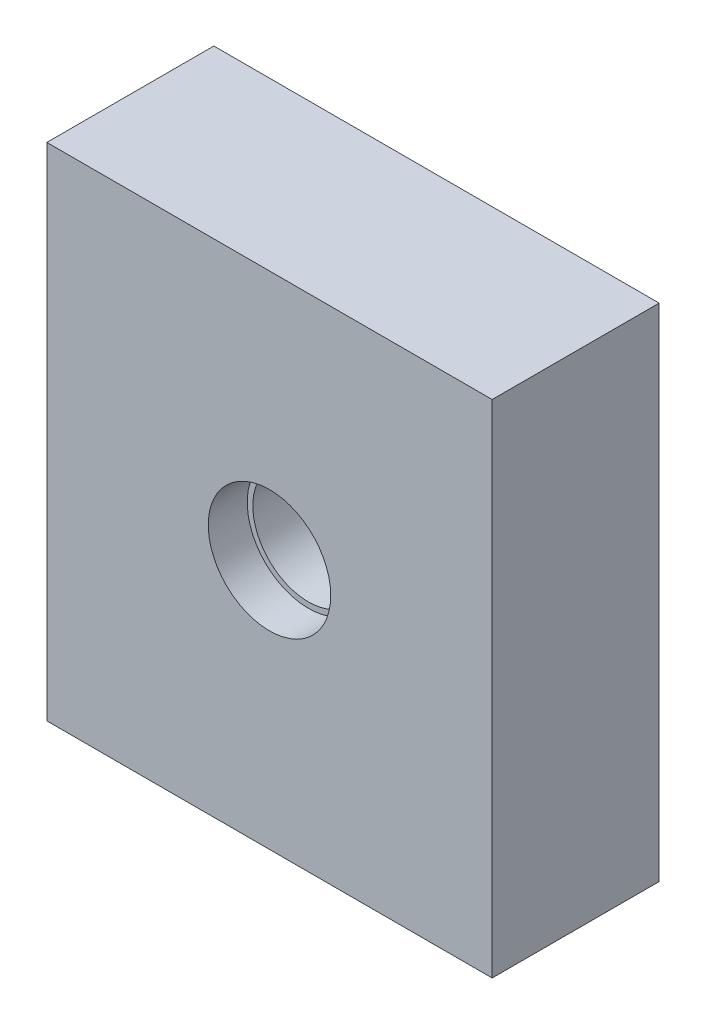
ISO-10303-21;
HEADER;
FILE_DESCRIPTION(('STEP AP214'),'2;1');
FILE_NAME('part.step','',(''),(''),'','','');
FILE_SCHEMA(('AUTOMOTIVE_DESIGN { 1 0 10303 214 1 1 1 1 }'));
ENDSEC;
DATA;
#1=APPLICATION_CONTEXT('core data for automotive mechanical design processes');
#2=APPLICATION_PROTOCOL_DEFINITION('international standard','automotive_design',2000,#1);
#3=PRODUCT_CONTEXT('',#1,'mechanical');
#4=PRODUCT('Part','Part','',(#3));
#5=PRODUCT_RELATED_PRODUCT_CATEGORY('part','',(#4));
#6=PRODUCT_DEFINITION_FORMATION('','',#4);
#7=PRODUCT_DEFINITION_CONTEXT('part definition',#1,'design');
#8=PRODUCT_DEFINITION('design','',#6,#7);
#9=PRODUCT_DEFINITION_SHAPE('','',#8);
#10=(LENGTH_UNIT() NAMED_UNIT(*) SI_UNIT(.MILLI.,.METRE.));
#11=(NAMED_UNIT(*) PLANE_ANGLE_UNIT() SI_UNIT($,.RADIAN.));
#12=(NAMED_UNIT(*) SI_UNIT($,.STERADIAN.) SOLID_ANGLE_UNIT());
#13=UNCERTAINTY_MEASURE_WITH_UNIT(LENGTH_MEASURE(1.E-05),#10,'distance_accuracy_value','');
#14=(GEOMETRIC_REPRESENTATION_CONTEXT(3) GLOBAL_UNCERTAINTY_ASSIGNED_CONTEXT((#13)) GLOBAL_UNIT_ASSIGNED_CONTEXT((#10,
#11,#12)) REPRESENTATION_CONTEXT('',''));
#15=CARTESIAN_POINT('',(0.,0.,0.));
#16=DIRECTION('',(0.,0.,1.));
#17=DIRECTION('',(1.,0.,0.));
#18=AXIS2_PLACEMENT_3D('',#15,#16,#17);
#19=CARTESIAN_POINT('',(0.,0.,30.));
#20=DIRECTION('',(-1.,0.,0.));
#21=DIRECTION('',(0.,0.,1.));
#22=AXIS2_PLACEMENT_3D('',#19,#20,#21);
#23=PLANE('',#22);
#24=DIRECTION('',(0.,1.,0.));
#25=VECTOR('',#24,1.);
#26=CARTESIAN_POINT('',(0.,0.,0.));
#27=LINE('',#26,#25);
#28=CARTESIAN_POINT('',(0.,0.,0.));
#29=VERTEX_POINT('',#28);
#30=CARTESIAN_POINT('',(0.,90.,0.));
#31=VERTEX_POINT('',#30);
#32=EDGE_CURVE('E159',#29,#31,#27,.T.);
#33=ORIENTED_EDGE('',*,*,#32,.F.);
#34=DIRECTION('',(0.,0.,-1.));
#35=VECTOR('',#34,1.);
#36=CARTESIAN_POINT('',(0.,0.,30.));
#37=LINE('',#36,#35);
#38=CARTESIAN_POINT('',(0.,0.,30.));
#39=VERTEX_POINT('',#38);
#40=EDGE_CURVE('E11',#39,#29,#37,.T.);
#41=ORIENTED_EDGE('',*,*,#40,.F.);
#42=DIRECTION('',(0.,1.,0.));
#43=VECTOR('',#42,1.);
#44=CARTESIAN_POINT('',(0.,0.,30.));
#45=LINE('',#44,#43);
#46=CARTESIAN_POINT('',(0.,90.,30.));
#47=VERTEX_POINT('',#46);
#48=EDGE_CURVE('E160',#39,#47,#45,.T.);
#49=ORIENTED_EDGE('',*,*,#48,.T.);
#50=DIRECTION('',(0.,0.,-1.));
#51=VECTOR('',#50,1.);
#52=CARTESIAN_POINT('',(0.,90.,30.));
#53=LINE('',#52,#51);
#54=EDGE_CURVE('E35',#47,#31,#53,.T.);
#55=ORIENTED_EDGE('',*,*,#54,.T.);
#56=EDGE_LOOP('',(#33,#41,#49,#55));
#57=FACE_BOUND('',#56,.T.);
#58=ADVANCED_FACE('F32',(#57),#23,.T.);
#59=CARTESIAN_POINT('',(80.,0.,30.));
#60=DIRECTION('',(0.,-1.,0.));
#61=DIRECTION('',(1.,0.,0.));
#62=AXIS2_PLACEMENT_3D('',#59,#60,#61);
#63=PLANE('',#62);
#64=DIRECTION('',(-1.,0.,0.));
#65=VECTOR('',#64,1.);
#66=CARTESIAN_POINT('',(80.,0.,0.));
#67=LINE('',#66,#65);
#68=CARTESIAN_POINT('',(80.,0.,0.));
#69=VERTEX_POINT('',#68);
#70=EDGE_CURVE('E163',#69,#29,#67,.T.);
#71=ORIENTED_EDGE('',*,*,#70,.F.);
#72=DIRECTION('',(0.,0.,-1.));
#73=VECTOR('',#72,1.);
#74=CARTESIAN_POINT('',(80.,0.,30.));
#75=LINE('',#74,#73);
#76=CARTESIAN_POINT('',(80.,0.,30.));
#77=VERTEX_POINT('',#76);
#78=EDGE_CURVE('E41',#77,#69,#75,.T.);
#79=ORIENTED_EDGE('',*,*,#78,.F.);
#80=DIRECTION('',(-1.,0.,0.));
#81=VECTOR('',#80,1.);
#82=CARTESIAN_POINT('',(80.,0.,30.));
#83=LINE('',#82,#81);
#84=EDGE_CURVE('E167',#77,#39,#83,.T.);
#85=ORIENTED_EDGE('',*,*,#84,.T.);
#86=ORIENTED_EDGE('',*,*,#40,.T.);
#87=EDGE_LOOP('',(#71,#79,#85,#86));
#88=FACE_BOUND('',#87,.T.);
#89=ADVANCED_FACE('F182',(#88),#63,.T.);
#90=CARTESIAN_POINT('',(80.,90.,30.));
#91=DIRECTION('',(1.,0.,0.));
#92=DIRECTION('',(0.,1.,0.));
#93=AXIS2_PLACEMENT_3D('',#90,#91,#92);
#94=PLANE('',#93);
#95=DIRECTION('',(0.,-1.,0.));
#96=VECTOR('',#95,1.);
#97=CARTESIAN_POINT('',(80.,90.,0.));
#98=LINE('',#97,#96);
#99=CARTESIAN_POINT('',(80.,90.,0.));
#100=VERTEX_POINT('',#99);
#101=EDGE_CURVE('E174',#100,#69,#98,.T.);
#102=ORIENTED_EDGE('',*,*,#101,.F.);
#103=DIRECTION('',(0.,0.,-1.));
#104=VECTOR('',#103,1.);
#105=CARTESIAN_POINT('',(80.,90.,30.));
#106=LINE('',#105,#104);
#107=CARTESIAN_POINT('',(80.,90.,30.));
#108=VERTEX_POINT('',#107);
#109=EDGE_CURVE('E178',#108,#100,#106,.T.);
#110=ORIENTED_EDGE('',*,*,#109,.F.);
#111=DIRECTION('',(0.,-1.,0.));
#112=VECTOR('',#111,1.);
#113=CARTESIAN_POINT('',(80.,90.,30.));
#114=LINE('',#113,#112);
#115=EDGE_CURVE('E165',#108,#77,#114,.T.);
#116=ORIENTED_EDGE('',*,*,#115,.T.);
#117=ORIENTED_EDGE('',*,*,#78,.T.);
#118=EDGE_LOOP('',(#102,#110,#116,#117));
#119=FACE_BOUND('',#118,.T.);
#120=ADVANCED_FACE('F185',(#119),#94,.T.);
#121=CARTESIAN_POINT('',(0.,90.,30.));
#122=DIRECTION('',(0.,1.,0.));
#123=DIRECTION('',(-1.,0.,0.));
#124=AXIS2_PLACEMENT_3D('',#121,#122,#123);
#125=PLANE('',#124);
#126=DIRECTION('',(1.,0.,0.));
#127=VECTOR('',#126,1.);
#128=CARTESIAN_POINT('',(0.,90.,0.));
#129=LINE('',#128,#127);
#130=EDGE_CURVE('E171',#31,#100,#129,.T.);
#131=ORIENTED_EDGE('',*,*,#130,.F.);
#132=ORIENTED_EDGE('',*,*,#54,.F.);
#133=DIRECTION('',(1.,0.,0.));
#134=VECTOR('',#133,1.);
#135=CARTESIAN_POINT('',(0.,90.,30.));
#136=LINE('',#135,#134);
#137=EDGE_CURVE('E162',#47,#108,#136,.T.);
#138=ORIENTED_EDGE('',*,*,#137,.T.);
#139=ORIENTED_EDGE('',*,*,#109,.T.);
#140=EDGE_LOOP('',(#131,#132,#138,#139));
#141=FACE_BOUND('',#140,.T.);
#142=ADVANCED_FACE('F179',(#141),#125,.T.);
#143=CARTESIAN_POINT('',(0.,0.,30.));
#144=DIRECTION('',(0.,0.,-1.));
#145=DIRECTION('',(-1.,0.,0.));
#146=AXIS2_PLACEMENT_3D('',#143,#144,#145);
#147=PLANE('',#146);
#148=CARTESIAN_POINT('',(40.,45.,30.));
#149=DIRECTION('',(0.,0.,1.));
#150=DIRECTION('',(1.,0.,0.));
#151=AXIS2_PLACEMENT_3D('',#148,#149,#150);
#152=CIRCLE('',#151,11.);
#153=CARTESIAN_POINT('',(51.,45.,30.));
#154=VERTEX_POINT('',#153);
#155=EDGE_CURVE('E153',#154,#154,#152,.T.);
#156=ORIENTED_EDGE('',*,*,#155,.F.);
#157=EDGE_LOOP('',(#156));
#158=FACE_BOUND('',#157,.T.);
#159=ORIENTED_EDGE('',*,*,#48,.F.);
#160=ORIENTED_EDGE('',*,*,#84,.F.);
#161=ORIENTED_EDGE('',*,*,#115,.F.);
#162=ORIENTED_EDGE('',*,*,#137,.F.);
#163=EDGE_LOOP('',(#159,#160,#161,#162));
#164=FACE_BOUND('',#163,.T.);
#165=ADVANCED_FACE('F187',(#158,#164),#147,.F.);
#166=CARTESIAN_POINT('',(0.,0.,0.));
#167=DIRECTION('',(0.,0.,-1.));
#168=DIRECTION('',(-1.,0.,0.));
#169=AXIS2_PLACEMENT_3D('',#166,#167,#168);
#170=PLANE('',#169);
#171=CARTESIAN_POINT('',(30.,10.,0.));
#172=DIRECTION('',(0.,0.,-1.));
#173=DIRECTION('',(-1.,0.,0.));
#174=AXIS2_PLACEMENT_3D('',#171,#172,#173);
#175=CIRCLE('',#174,4.);
#176=CARTESIAN_POINT('',(26.,10.,0.));
#177=VERTEX_POINT('',#176);
#178=EDGE_CURVE('E107',#177,#177,#175,.T.);
#179=ORIENTED_EDGE('',*,*,#178,.F.);
#180=EDGE_LOOP('',(#179));
#181=FACE_BOUND('',#180,.T.);
#182=CARTESIAN_POINT('',(30.,80.,0.));
#183=DIRECTION('',(0.,0.,-1.));
#184=DIRECTION('',(-1.,0.,0.));
#185=AXIS2_PLACEMENT_3D('',#182,#183,#184);
#186=CIRCLE('',#185,4.);
#187=CARTESIAN_POINT('',(26.,80.,0.));
#188=VERTEX_POINT('',#187);
#189=EDGE_CURVE('E106',#188,#188,#186,.T.);
#190=ORIENTED_EDGE('',*,*,#189,.F.);
#191=EDGE_LOOP('',(#190));
#192=FACE_BOUND('',#191,.T.);
#193=CARTESIAN_POINT('',(65.,10.,0.));
#194=DIRECTION('',(0.,0.,-1.));
#195=DIRECTION('',(-1.,0.,0.));
#196=AXIS2_PLACEMENT_3D('',#193,#194,#195);
#197=CIRCLE('',#196,4.);
#198=CARTESIAN_POINT('',(61.,10.,0.));
#199=VERTEX_POINT('',#198);
#200=EDGE_CURVE('E117',#199,#199,#197,.T.);
#201=ORIENTED_EDGE('',*,*,#200,.F.);
#202=EDGE_LOOP('',(#201));
#203=FACE_BOUND('',#202,.T.);
#204=CARTESIAN_POINT('',(65.,80.,0.));
#205=DIRECTION('',(0.,0.,-1.));
#206=DIRECTION('',(-1.,0.,0.));
#207=AXIS2_PLACEMENT_3D('',#204,#205,#206);
#208=CIRCLE('',#207,4.);
#209=CARTESIAN_POINT('',(61.,80.,0.));
#210=VERTEX_POINT('',#209);
#211=EDGE_CURVE('E123',#210,#210,#208,.T.);
#212=ORIENTED_EDGE('',*,*,#211,.F.);
#213=EDGE_LOOP('',(#212));
#214=FACE_BOUND('',#213,.T.);
#215=CARTESIAN_POINT('',(26.75,63.7999335105207,0.));
#216=DIRECTION('',(0.,0.,-1.));
#217=DIRECTION('',(-1.,0.,0.));
#218=AXIS2_PLACEMENT_3D('',#215,#216,#217);
#219=CIRCLE('',#218,1.24999999999999);
#220=CARTESIAN_POINT('',(25.5,63.7999335105207,0.));
#221=VERTEX_POINT('',#220);
#222=EDGE_CURVE('E129',#221,#221,#219,.T.);
#223=ORIENTED_EDGE('',*,*,#222,.F.);
#224=EDGE_LOOP('',(#223));
#225=FACE_BOUND('',#224,.T.);
#226=CARTESIAN_POINT('',(53.25,26.2000664894793,0.));
#227=DIRECTION('',(0.,0.,-1.));
#228=DIRECTION('',(-1.,0.,0.));
#229=AXIS2_PLACEMENT_3D('',#226,#227,#228);
#230=CIRCLE('',#229,1.24999999999999);
#231=CARTESIAN_POINT('',(52.,26.2000664894793,0.));
#232=VERTEX_POINT('',#231);
#233=EDGE_CURVE('E135',#232,#232,#230,.T.);
#234=ORIENTED_EDGE('',*,*,#233,.F.);
#235=EDGE_LOOP('',(#234));
#236=FACE_BOUND('',#235,.T.);
#237=CARTESIAN_POINT('',(40.,45.,0.));
#238=DIRECTION('',(0.,0.,1.));
#239=DIRECTION('',(1.,0.,0.));
#240=AXIS2_PLACEMENT_3D('',#237,#238,#239);
#241=CIRCLE('',#240,11.);
#242=CARTESIAN_POINT('',(51.,45.,0.));
#243=VERTEX_POINT('',#242);
#244=EDGE_CURVE('E156',#243,#243,#241,.T.);
#245=ORIENTED_EDGE('',*,*,#244,.T.);
#246=EDGE_LOOP('',(#245));
#247=FACE_BOUND('',#246,.T.);
#248=ORIENTED_EDGE('',*,*,#32,.T.);
#249=ORIENTED_EDGE('',*,*,#130,.T.);
#250=ORIENTED_EDGE('',*,*,#101,.T.);
#251=ORIENTED_EDGE('',*,*,#70,.T.);
#252=EDGE_LOOP('',(#248,#249,#250,#251));
#253=FACE_BOUND('',#252,.T.);
#254=ADVANCED_FACE('F181',(#181,#192,#203,#214,#225,#236,#247,#253),#170,.T.);
#255=CARTESIAN_POINT('',(40.,45.,0.));
#256=DIRECTION('',(0.,0.,1.));
#257=DIRECTION('',(1.,0.,0.));
#258=AXIS2_PLACEMENT_3D('',#255,#256,#257);
#259=CYLINDRICAL_SURFACE('',#258,11.);
#260=ORIENTED_EDGE('',*,*,#244,.F.);
#261=EDGE_LOOP('',(#260));
#262=FACE_BOUND('',#261,.T.);
#263=CARTESIAN_POINT('',(40.,45.,8.));
#264=DIRECTION('',(0.,0.,1.));
#265=DIRECTION('',(1.,0.,0.));
#266=AXIS2_PLACEMENT_3D('',#263,#264,#265);
#267=CIRCLE('',#266,11.);
#268=CARTESIAN_POINT('',(51.,45.,8.));
#269=VERTEX_POINT('',#268);
#270=EDGE_CURVE('E141',#269,#269,#267,.T.);
#271=ORIENTED_EDGE('',*,*,#270,.T.);
#272=EDGE_LOOP('',(#271));
#273=FACE_BOUND('',#272,.T.);
#274=ADVANCED_FACE('F195',(#262,#273),#259,.F.);
#275=CARTESIAN_POINT('',(40.,45.,0.));
#276=DIRECTION('',(0.,0.,1.));
#277=DIRECTION('',(1.,0.,0.));
#278=AXIS2_PLACEMENT_3D('',#275,#276,#277);
#279=CYLINDRICAL_SURFACE('',#278,11.);
#280=CARTESIAN_POINT('',(40.,45.,23.));
#281=DIRECTION('',(0.,0.,1.));
#282=DIRECTION('',(1.,0.,0.));
#283=AXIS2_PLACEMENT_3D('',#280,#281,#282);
#284=CIRCLE('',#283,11.);
#285=CARTESIAN_POINT('',(51.,45.,23.));
#286=VERTEX_POINT('',#285);
#287=EDGE_CURVE('E150',#286,#286,#284,.T.);
#288=ORIENTED_EDGE('',*,*,#287,.F.);
#289=EDGE_LOOP('',(#288));
#290=FACE_BOUND('',#289,.T.);
#291=ORIENTED_EDGE('',*,*,#155,.T.);
#292=EDGE_LOOP('',(#291));
#293=FACE_BOUND('',#292,.T.);
#294=ADVANCED_FACE('F229',(#290,#293),#279,.F.);
#295=CARTESIAN_POINT('',(29.,45.,23.));
#296=DIRECTION('',(0.,0.,-1.));
#297=DIRECTION('',(-1.,0.,0.));
#298=AXIS2_PLACEMENT_3D('',#295,#296,#297);
#299=PLANE('',#298);
#300=CARTESIAN_POINT('',(40.,45.,23.));
#301=DIRECTION('',(0.,0.,1.));
#302=DIRECTION('',(1.,0.,0.));
#303=AXIS2_PLACEMENT_3D('',#300,#301,#302);
#304=CIRCLE('',#303,10.);
#305=CARTESIAN_POINT('',(50.,45.,23.));
#306=VERTEX_POINT('',#305);
#307=EDGE_CURVE('E147',#306,#306,#304,.T.);
#308=ORIENTED_EDGE('',*,*,#307,.F.);
#309=EDGE_LOOP('',(#308));
#310=FACE_BOUND('',#309,.T.);
#311=ORIENTED_EDGE('',*,*,#287,.T.);
#312=EDGE_LOOP('',(#311));
#313=FACE_BOUND('',#312,.T.);
#314=ADVANCED_FACE('F238',(#310,#313),#299,.F.);
#315=CARTESIAN_POINT('',(40.,45.,0.));
#316=DIRECTION('',(0.,0.,1.));
#317=DIRECTION('',(1.,0.,0.));
#318=AXIS2_PLACEMENT_3D('',#315,#316,#317);
#319=CYLINDRICAL_SURFACE('',#318,10.);
#320=CARTESIAN_POINT('',(40.,45.,8.));
#321=DIRECTION('',(0.,0.,1.));
#322=DIRECTION('',(1.,0.,0.));
#323=AXIS2_PLACEMENT_3D('',#320,#321,#322);
#324=CIRCLE('',#323,10.);
#325=CARTESIAN_POINT('',(50.,45.,8.));
#326=VERTEX_POINT('',#325);
#327=EDGE_CURVE('E144',#326,#326,#324,.T.);
#328=ORIENTED_EDGE('',*,*,#327,.F.);
#329=EDGE_LOOP('',(#328));
#330=FACE_BOUND('',#329,.T.);
#331=ORIENTED_EDGE('',*,*,#307,.T.);
#332=EDGE_LOOP('',(#331));
#333=FACE_BOUND('',#332,.T.);
#334=ADVANCED_FACE('F248',(#330,#333),#319,.F.);
#335=CARTESIAN_POINT('',(30.,45.,8.));
#336=DIRECTION('',(0.,0.,1.));
#337=DIRECTION('',(1.,0.,0.));
#338=AXIS2_PLACEMENT_3D('',#335,#336,#337);
#339=PLANE('',#338);
#340=ORIENTED_EDGE('',*,*,#270,.F.);
#341=EDGE_LOOP('',(#340));
#342=FACE_BOUND('',#341,.T.);
#343=ORIENTED_EDGE('',*,*,#327,.T.);
#344=EDGE_LOOP('',(#343));
#345=FACE_BOUND('',#344,.T.);
#346=ADVANCED_FACE('F258',(#342,#345),#339,.F.);
#347=CARTESIAN_POINT('',(53.25,26.2000664894793,6.99999999999999));
#348=DIRECTION('',(0.,0.,-1.));
#349=DIRECTION('',(-1.,0.,0.));
#350=AXIS2_PLACEMENT_3D('',#347,#348,#349);
#351=CONICAL_SURFACE('',#350,1.24999999999999,1.04719755119659);
#352=CARTESIAN_POINT('',(53.25,26.2000664894793,7.72168783648703));
#353=VERTEX_POINT('',#352);
#354=VERTEX_LOOP('',#353);
#355=FACE_BOUND('',#354,.T.);
#356=CARTESIAN_POINT('',(53.25,26.2000664894793,6.99999999999999));
#357=DIRECTION('',(0.,0.,-1.));
#358=DIRECTION('',(-1.,0.,0.));
#359=AXIS2_PLACEMENT_3D('',#356,#357,#358);
#360=CIRCLE('',#359,1.24999999999999);
#361=CARTESIAN_POINT('',(52.,26.2000664894793,6.99999999999999));
#362=VERTEX_POINT('',#361);
#363=EDGE_CURVE('E138',#362,#362,#360,.T.);
#364=ORIENTED_EDGE('',*,*,#363,.T.);
#365=EDGE_LOOP('',(#364));
#366=FACE_BOUND('',#365,.T.);
#367=ADVANCED_FACE('F268',(#355,#366),#351,.F.);
#368=CARTESIAN_POINT('',(53.25,26.2000664894793,0.));
#369=DIRECTION('',(0.,0.,-1.));
#370=DIRECTION('',(-1.,0.,0.));
#371=AXIS2_PLACEMENT_3D('',#368,#369,#370);
#372=CYLINDRICAL_SURFACE('',#371,1.24999999999999);
#373=ORIENTED_EDGE('',*,*,#363,.F.);
#374=EDGE_LOOP('',(#373));
#375=FACE_BOUND('',#374,.T.);
#376=ORIENTED_EDGE('',*,*,#233,.T.);
#377=EDGE_LOOP('',(#376));
#378=FACE_BOUND('',#377,.T.);
#379=ADVANCED_FACE('F278',(#375,#378),#372,.F.);
#380=CARTESIAN_POINT('',(26.75,63.7999335105207,6.99999999999999));
#381=DIRECTION('',(0.,0.,-1.));
#382=DIRECTION('',(-1.,0.,0.));
#383=AXIS2_PLACEMENT_3D('',#380,#381,#382);
#384=CONICAL_SURFACE('',#383,1.24999999999999,1.04719755119659);
#385=CARTESIAN_POINT('',(26.75,63.7999335105207,7.72168783648703));
#386=VERTEX_POINT('',#385);
#387=VERTEX_LOOP('',#386);
#388=FACE_BOUND('',#387,.T.);
#389=CARTESIAN_POINT('',(26.75,63.7999335105207,6.99999999999999));
#390=DIRECTION('',(0.,0.,-1.));
#391=DIRECTION('',(-1.,0.,0.));
#392=AXIS2_PLACEMENT_3D('',#389,#390,#391);
#393=CIRCLE('',#392,1.24999999999999);
#394=CARTESIAN_POINT('',(25.5,63.7999335105207,6.99999999999999));
#395=VERTEX_POINT('',#394);
#396=EDGE_CURVE('E132',#395,#395,#393,.T.);
#397=ORIENTED_EDGE('',*,*,#396,.T.);
#398=EDGE_LOOP('',(#397));
#399=FACE_BOUND('',#398,.T.);
#400=ADVANCED_FACE('F288',(#388,#399),#384,.F.);
#401=CARTESIAN_POINT('',(26.75,63.7999335105207,0.));
#402=DIRECTION('',(0.,0.,-1.));
#403=DIRECTION('',(-1.,0.,0.));
#404=AXIS2_PLACEMENT_3D('',#401,#402,#403);
#405=CYLINDRICAL_SURFACE('',#404,1.24999999999999);
#406=ORIENTED_EDGE('',*,*,#396,.F.);
#407=EDGE_LOOP('',(#406));
#408=FACE_BOUND('',#407,.T.);
#409=ORIENTED_EDGE('',*,*,#222,.T.);
#410=EDGE_LOOP('',(#409));
#411=FACE_BOUND('',#410,.T.);
#412=ADVANCED_FACE('F298',(#408,#411),#405,.F.);
#413=CARTESIAN_POINT('',(65.,80.,10.));
#414=DIRECTION('',(0.,0.,-1.));
#415=DIRECTION('',(-1.,0.,0.));
#416=AXIS2_PLACEMENT_3D('',#413,#414,#415);
#417=CONICAL_SURFACE('',#416,4.,1.0471975511966);
#418=CARTESIAN_POINT('',(65.,80.,12.3094010767585));
#419=VERTEX_POINT('',#418);
#420=VERTEX_LOOP('',#419);
#421=FACE_BOUND('',#420,.T.);
#422=CARTESIAN_POINT('',(65.,80.,10.));
#423=DIRECTION('',(0.,0.,-1.));
#424=DIRECTION('',(-1.,0.,0.));
#425=AXIS2_PLACEMENT_3D('',#422,#423,#424);
#426=CIRCLE('',#425,4.);
#427=CARTESIAN_POINT('',(61.,80.,10.));
#428=VERTEX_POINT('',#427);
#429=EDGE_CURVE('E126',#428,#428,#426,.T.);
#430=ORIENTED_EDGE('',*,*,#429,.T.);
#431=EDGE_LOOP('',(#430));
#432=FACE_BOUND('',#431,.T.);
#433=ADVANCED_FACE('F308',(#421,#432),#417,.F.);
#434=CARTESIAN_POINT('',(65.,80.,0.));
#435=DIRECTION('',(0.,0.,-1.));
#436=DIRECTION('',(-1.,0.,0.));
#437=AXIS2_PLACEMENT_3D('',#434,#435,#436);
#438=CYLINDRICAL_SURFACE('',#437,4.);
#439=ORIENTED_EDGE('',*,*,#429,.F.);
#440=EDGE_LOOP('',(#439));
#441=FACE_BOUND('',#440,.T.);
#442=ORIENTED_EDGE('',*,*,#211,.T.);
#443=EDGE_LOOP('',(#442));
#444=FACE_BOUND('',#443,.T.);
#445=ADVANCED_FACE('F323',(#441,#444),#438,.F.);
#446=CARTESIAN_POINT('',(65.,10.,10.));
#447=DIRECTION('',(0.,0.,-1.));
#448=DIRECTION('',(-1.,0.,0.));
#449=AXIS2_PLACEMENT_3D('',#446,#447,#448);
#450=CONICAL_SURFACE('',#449,4.,1.0471975511966);
#451=CARTESIAN_POINT('',(65.,10.,12.3094010767585));
#452=VERTEX_POINT('',#451);
#453=VERTEX_LOOP('',#452);
#454=FACE_BOUND('',#453,.T.);
#455=CARTESIAN_POINT('',(65.,10.,10.));
#456=DIRECTION('',(0.,0.,-1.));
#457=DIRECTION('',(-1.,0.,0.));
#458=AXIS2_PLACEMENT_3D('',#455,#456,#457);
#459=CIRCLE('',#458,4.);
#460=CARTESIAN_POINT('',(61.,10.,10.));
#461=VERTEX_POINT('',#460);
#462=EDGE_CURVE('E120',#461,#461,#459,.T.);
#463=ORIENTED_EDGE('',*,*,#462,.T.);
#464=EDGE_LOOP('',(#463));
#465=FACE_BOUND('',#464,.T.);
#466=ADVANCED_FACE('F333',(#454,#465),#450,.F.);
#467=CARTESIAN_POINT('',(65.,10.,0.));
#468=DIRECTION('',(0.,0.,-1.));
#469=DIRECTION('',(-1.,0.,0.));
#470=AXIS2_PLACEMENT_3D('',#467,#468,#469);
#471=CYLINDRICAL_SURFACE('',#470,4.);
#472=ORIENTED_EDGE('',*,*,#462,.F.);
#473=EDGE_LOOP('',(#472));
#474=FACE_BOUND('',#473,.T.);
#475=ORIENTED_EDGE('',*,*,#200,.T.);
#476=EDGE_LOOP('',(#475));
#477=FACE_BOUND('',#476,.T.);
#478=ADVANCED_FACE('F343',(#474,#477),#471,.F.);
#479=CARTESIAN_POINT('',(30.,80.,10.));
#480=DIRECTION('',(0.,0.,-1.));
#481=DIRECTION('',(-1.,0.,0.));
#482=AXIS2_PLACEMENT_3D('',#479,#480,#481);
#483=CONICAL_SURFACE('',#482,4.,1.0471975511966);
#484=CARTESIAN_POINT('',(30.,80.,12.3094010767585));
#485=VERTEX_POINT('',#484);
#486=VERTEX_LOOP('',#485);
#487=FACE_BOUND('',#486,.T.);
#488=CARTESIAN_POINT('',(30.,80.,10.));
#489=DIRECTION('',(0.,0.,-1.));
#490=DIRECTION('',(-1.,0.,0.));
#491=AXIS2_PLACEMENT_3D('',#488,#489,#490);
#492=CIRCLE('',#491,4.);
#493=CARTESIAN_POINT('',(26.,80.,10.));
#494=VERTEX_POINT('',#493);
#495=EDGE_CURVE('E110',#494,#494,#492,.T.);
#496=ORIENTED_EDGE('',*,*,#495,.T.);
#497=EDGE_LOOP('',(#496));
#498=FACE_BOUND('',#497,.T.);
#499=ADVANCED_FACE('F353',(#487,#498),#483,.F.);
#500=CARTESIAN_POINT('',(30.,80.,0.));
#501=DIRECTION('',(0.,0.,-1.));
#502=DIRECTION('',(-1.,0.,0.));
#503=AXIS2_PLACEMENT_3D('',#500,#501,#502);
#504=CYLINDRICAL_SURFACE('',#503,4.);
#505=ORIENTED_EDGE('',*,*,#495,.F.);
#506=EDGE_LOOP('',(#505));
#507=FACE_BOUND('',#506,.T.);
#508=ORIENTED_EDGE('',*,*,#189,.T.);
#509=EDGE_LOOP('',(#508));
#510=FACE_BOUND('',#509,.T.);
#511=ADVANCED_FACE('F100',(#507,#510),#504,.F.);
#512=CARTESIAN_POINT('',(30.,10.,10.));
#513=DIRECTION('',(0.,0.,-1.));
#514=DIRECTION('',(-1.,0.,0.));
#515=AXIS2_PLACEMENT_3D('',#512,#513,#514);
#516=CONICAL_SURFACE('',#515,4.,1.0471975511966);
#517=CARTESIAN_POINT('',(30.,10.,12.3094010767585));
#518=VERTEX_POINT('',#517);
#519=VERTEX_LOOP('',#518);
#520=FACE_BOUND('',#519,.T.);
#521=CARTESIAN_POINT('',(30.,10.,10.));
#522=DIRECTION('',(0.,0.,-1.));
#523=DIRECTION('',(-1.,0.,0.));
#524=AXIS2_PLACEMENT_3D('',#521,#522,#523);
#525=CIRCLE('',#524,4.);
#526=CARTESIAN_POINT('',(26.,10.,10.));
#527=VERTEX_POINT('',#526);
#528=EDGE_CURVE('E104',#527,#527,#525,.T.);
#529=ORIENTED_EDGE('',*,*,#528,.T.);
#530=EDGE_LOOP('',(#529));
#531=FACE_BOUND('',#530,.T.);
#532=ADVANCED_FACE('F96',(#520,#531),#516,.F.);
#533=CARTESIAN_POINT('',(30.,10.,0.));
#534=DIRECTION('',(0.,0.,-1.));
#535=DIRECTION('',(-1.,0.,0.));
#536=AXIS2_PLACEMENT_3D('',#533,#534,#535);
#537=CYLINDRICAL_SURFACE('',#536,4.);
#538=ORIENTED_EDGE('',*,*,#528,.F.);
#539=EDGE_LOOP('',(#538));
#540=FACE_BOUND('',#539,.T.);
#541=ORIENTED_EDGE('',*,*,#178,.T.);
#542=EDGE_LOOP('',(#541));
#543=FACE_BOUND('',#542,.T.);
#544=ADVANCED_FACE('F99',(#540,#543),#537,.F.);
#545=CLOSED_SHELL('',(#58,#89,#120,#142,#165,#254,#274,#294,#314,#334,#346,#367,#379,#400,#412,
#433,#445,#466,#478,#499,#511,#532,#544));
#546=MANIFOLD_SOLID_BREP('B2',#545);
#547=ADVANCED_BREP_SHAPE_REPRESENTATION('',(#18,#546),#14);
#548=SHAPE_DEFINITION_REPRESENTATION(#9,#547);
ENDSEC;
END-ISO-10303-21;
